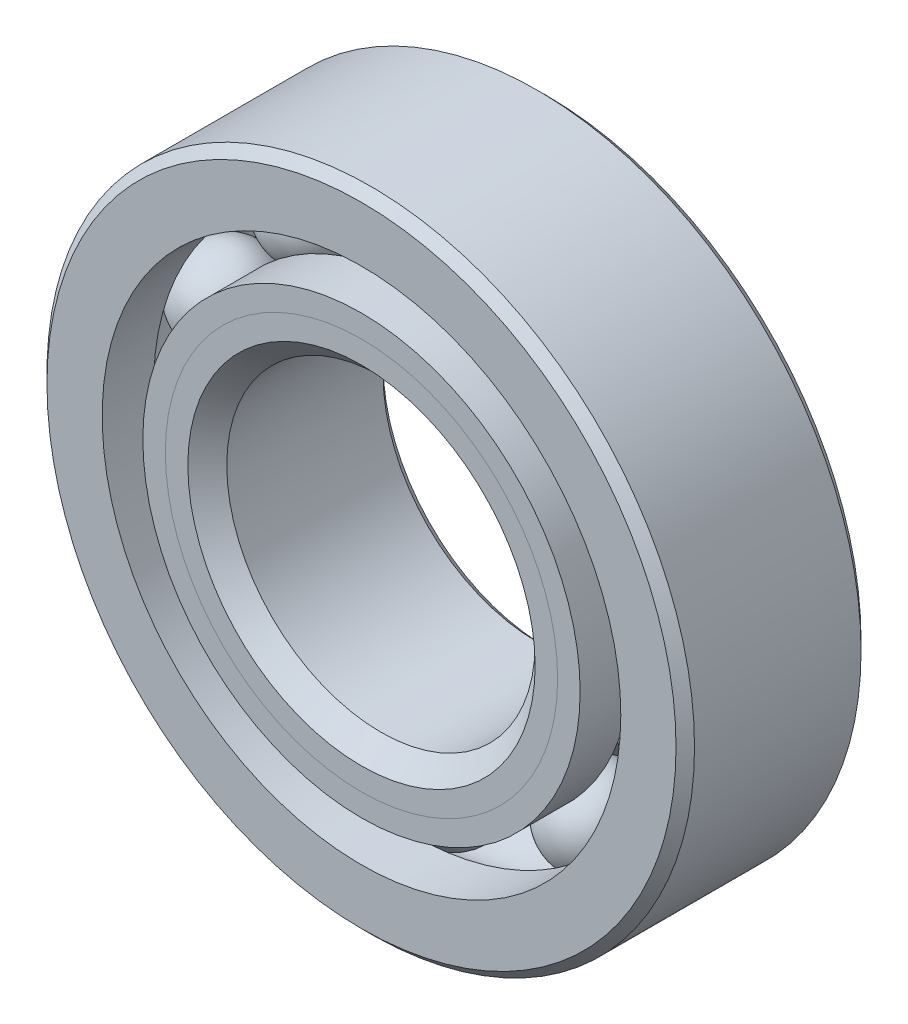
ISO-10303-21;
HEADER;
FILE_DESCRIPTION(('STEP AP214'),'2;1');
FILE_NAME('part.step','',(''),(''),'','','');
FILE_SCHEMA(('AUTOMOTIVE_DESIGN { 1 0 10303 214 1 1 1 1 }'));
ENDSEC;
DATA;
#1=APPLICATION_CONTEXT('core data for automotive mechanical design processes');
#2=APPLICATION_PROTOCOL_DEFINITION('international standard','automotive_design',2000,#1);
#3=PRODUCT_CONTEXT('',#1,'mechanical');
#4=PRODUCT('Part','Part','',(#3));
#5=PRODUCT_RELATED_PRODUCT_CATEGORY('part','',(#4));
#6=PRODUCT_DEFINITION_FORMATION('','',#4);
#7=PRODUCT_DEFINITION_CONTEXT('part definition',#1,'design');
#8=PRODUCT_DEFINITION('design','',#6,#7);
#9=PRODUCT_DEFINITION_SHAPE('','',#8);
#10=(LENGTH_UNIT() NAMED_UNIT(*) SI_UNIT(.MILLI.,.METRE.));
#11=(NAMED_UNIT(*) PLANE_ANGLE_UNIT() SI_UNIT($,.RADIAN.));
#12=(NAMED_UNIT(*) SI_UNIT($,.STERADIAN.) SOLID_ANGLE_UNIT());
#13=UNCERTAINTY_MEASURE_WITH_UNIT(LENGTH_MEASURE(1.E-05),#10,'distance_accuracy_value','');
#14=(GEOMETRIC_REPRESENTATION_CONTEXT(3) GLOBAL_UNCERTAINTY_ASSIGNED_CONTEXT((#13)) GLOBAL_UNIT_ASSIGNED_CONTEXT((#10,
#11,#12)) REPRESENTATION_CONTEXT('',''));
#15=CARTESIAN_POINT('',(0.,0.,0.));
#16=DIRECTION('',(0.,0.,1.));
#17=DIRECTION('',(1.,0.,0.));
#18=AXIS2_PLACEMENT_3D('',#15,#16,#17);
#19=CARTESIAN_POINT('',(-9.11067141053317,12.5397634128118,0.));
#20=DIRECTION('',(0.,0.,1.));
#21=DIRECTION('',(-0.587785252292462,0.809016994374955,0.));
#22=AXIS2_PLACEMENT_3D('',#19,#20,#21);
#23=SPHERICAL_SURFACE('',#22,2.97490025569769);
#24=CARTESIAN_POINT('',(-9.11067141053317,12.5397634128118,2.97490025569769));
#25=VERTEX_POINT('',#24);
#26=VERTEX_LOOP('',#25);
#27=FACE_BOUND('',#26,.T.);
#28=ADVANCED_FACE('F39',(#27),#23,.T.);
#29=CLOSED_SHELL('',(#28));
#30=MANIFOLD_SOLID_BREP('B2',#29);
#31=CARTESIAN_POINT('',(-14.7413760025748,4.78976341281185,0.));
#32=DIRECTION('',(0.,0.,1.));
#33=DIRECTION('',(-0.95105651629515,0.309016994374958,0.));
#34=AXIS2_PLACEMENT_3D('',#31,#32,#33);
#35=SPHERICAL_SURFACE('',#34,2.97490025569769);
#36=CARTESIAN_POINT('',(-14.7413760025748,4.78976341281185,2.97490025569769));
#37=VERTEX_POINT('',#36);
#38=VERTEX_LOOP('',#37);
#39=FACE_BOUND('',#38,.T.);
#40=ADVANCED_FACE('F72',(#39),#35,.T.);
#41=CLOSED_SHELL('',(#40));
#42=MANIFOLD_SOLID_BREP('B6',#41);
#43=CARTESIAN_POINT('',(-14.7413760025749,-4.78976341281154,0.));
#44=DIRECTION('',(0.,0.,1.));
#45=DIRECTION('',(-0.951056516295157,-0.309016994374938,0.));
#46=AXIS2_PLACEMENT_3D('',#43,#44,#45);
#47=SPHERICAL_SURFACE('',#46,2.97490025569769);
#48=CARTESIAN_POINT('',(-14.7413760025749,-4.78976341281154,2.97490025569769));
#49=VERTEX_POINT('',#48);
#50=VERTEX_LOOP('',#49);
#51=FACE_BOUND('',#50,.T.);
#52=ADVANCED_FACE('F105',(#51),#47,.T.);
#53=CLOSED_SHELL('',(#52));
#54=MANIFOLD_SOLID_BREP('B35',#53);
#55=CARTESIAN_POINT('',(-9.11067141053344,-12.5397634128116,0.));
#56=DIRECTION('',(0.,0.,1.));
#57=DIRECTION('',(-0.58778525229248,-0.809016994374942,0.));
#58=AXIS2_PLACEMENT_3D('',#55,#56,#57);
#59=SPHERICAL_SURFACE('',#58,2.97490025569769);
#60=CARTESIAN_POINT('',(-9.11067141053344,-12.5397634128116,2.97490025569769));
#61=VERTEX_POINT('',#60);
#62=VERTEX_LOOP('',#61);
#63=FACE_BOUND('',#62,.T.);
#64=ADVANCED_FACE('F138',(#63),#59,.T.);
#65=CLOSED_SHELL('',(#64));
#66=MANIFOLD_SOLID_BREP('B68',#65);
#67=CARTESIAN_POINT('',(-1.08235921504137E-13,-15.5,0.));
#68=DIRECTION('',(0.,0.,1.));
#69=DIRECTION('',(0.,-1.,0.));
#70=AXIS2_PLACEMENT_3D('',#67,#68,#69);
#71=SPHERICAL_SURFACE('',#70,2.97490025569769);
#72=CARTESIAN_POINT('',(-1.08235921504137E-13,-15.5,2.97490025569769));
#73=VERTEX_POINT('',#72);
#74=VERTEX_LOOP('',#73);
#75=FACE_BOUND('',#74,.T.);
#76=ADVANCED_FACE('F171',(#75),#71,.T.);
#77=CLOSED_SHELL('',(#76));
#78=MANIFOLD_SOLID_BREP('B101',#77);
#79=CARTESIAN_POINT('',(9.11067141053326,-12.5397634128117,0.));
#80=DIRECTION('',(0.,0.,1.));
#81=DIRECTION('',(0.587785252292469,-0.809016994374951,0.));
#82=AXIS2_PLACEMENT_3D('',#79,#80,#81);
#83=SPHERICAL_SURFACE('',#82,2.97490025569769);
#84=CARTESIAN_POINT('',(9.11067141053326,-12.5397634128117,2.97490025569769));
#85=VERTEX_POINT('',#84);
#86=VERTEX_LOOP('',#85);
#87=FACE_BOUND('',#86,.T.);
#88=ADVANCED_FACE('F204',(#87),#83,.T.);
#89=CLOSED_SHELL('',(#88));
#90=MANIFOLD_SOLID_BREP('B134',#89);
#91=CARTESIAN_POINT('',(14.7413760025749,-4.78976341281175,0.));
#92=DIRECTION('',(0.,0.,1.));
#93=DIRECTION('',(0.951056516295152,-0.309016994374952,0.));
#94=AXIS2_PLACEMENT_3D('',#91,#92,#93);
#95=SPHERICAL_SURFACE('',#94,2.97490025569769);
#96=CARTESIAN_POINT('',(14.7413760025749,-4.78976341281175,2.97490025569769));
#97=VERTEX_POINT('',#96);
#98=VERTEX_LOOP('',#97);
#99=FACE_BOUND('',#98,.T.);
#100=ADVANCED_FACE('F237',(#99),#95,.T.);
#101=CLOSED_SHELL('',(#100));
#102=MANIFOLD_SOLID_BREP('B167',#101);
#103=CARTESIAN_POINT('',(14.7413760025749,4.78976341281164,0.));
#104=DIRECTION('',(0.,0.,1.));
#105=DIRECTION('',(0.951056516295155,0.309016994374945,0.));
#106=AXIS2_PLACEMENT_3D('',#103,#104,#105);
#107=SPHERICAL_SURFACE('',#106,2.97490025569769);
#108=CARTESIAN_POINT('',(14.7413760025749,4.78976341281164,2.97490025569769));
#109=VERTEX_POINT('',#108);
#110=VERTEX_LOOP('',#109);
#111=FACE_BOUND('',#110,.T.);
#112=ADVANCED_FACE('F270',(#111),#107,.T.);
#113=CLOSED_SHELL('',(#112));
#114=MANIFOLD_SOLID_BREP('B200',#113);
#115=CARTESIAN_POINT('',(9.11067141053335,12.5397634128117,0.));
#116=DIRECTION('',(0.,0.,1.));
#117=DIRECTION('',(0.587785252292474,0.809016994374947,0.));
#118=AXIS2_PLACEMENT_3D('',#115,#116,#117);
#119=SPHERICAL_SURFACE('',#118,2.97490025569769);
#120=CARTESIAN_POINT('',(9.11067141053335,12.5397634128117,2.97490025569769));
#121=VERTEX_POINT('',#120);
#122=VERTEX_LOOP('',#121);
#123=FACE_BOUND('',#122,.T.);
#124=ADVANCED_FACE('F303',(#123),#119,.T.);
#125=CLOSED_SHELL('',(#124));
#126=MANIFOLD_SOLID_BREP('B233',#125);
#127=CARTESIAN_POINT('',(0.,15.5,0.));
#128=DIRECTION('',(0.,0.,1.));
#129=DIRECTION('',(0.,1.,0.));
#130=AXIS2_PLACEMENT_3D('',#127,#128,#129);
#131=SPHERICAL_SURFACE('',#130,2.97490025569769);
#132=CARTESIAN_POINT('',(0.,15.5,2.97490025569769));
#133=VERTEX_POINT('',#132);
#134=VERTEX_LOOP('',#133);
#135=FACE_BOUND('',#134,.T.);
#136=ADVANCED_FACE('F338',(#135),#131,.T.);
#137=CLOSED_SHELL('',(#136));
#138=MANIFOLD_SOLID_BREP('B266',#137);
#139=CARTESIAN_POINT('',(0.,12.7219342767349,6.));
#140=DIRECTION('',(0.,0.,-1.));
#141=DIRECTION('',(-1.,0.,0.));
#142=AXIS2_PLACEMENT_3D('',#139,#140,#141);
#143=PLANE('',#142);
#144=CARTESIAN_POINT('',(0.,0.,6.));
#145=DIRECTION('',(0.,0.,1.));
#146=DIRECTION('',(1.,0.,0.));
#147=AXIS2_PLACEMENT_3D('',#144,#145,#146);
#148=CIRCLE('',#147,11.2625498721512);
#149=CARTESIAN_POINT('',(11.2625498721512,0.,6.));
#150=VERTEX_POINT('',#149);
#151=EDGE_CURVE('E392',#150,#150,#148,.T.);
#152=ORIENTED_EDGE('',*,*,#151,.F.);
#153=EDGE_LOOP('',(#152));
#154=FACE_BOUND('',#153,.T.);
#155=CARTESIAN_POINT('',(0.,0.,6.));
#156=DIRECTION('',(0.,0.,1.));
#157=DIRECTION('',(1.,0.,0.));
#158=AXIS2_PLACEMENT_3D('',#155,#156,#157);
#159=CIRCLE('',#158,12.7219342767349);
#160=CARTESIAN_POINT('',(12.7219342767349,0.,6.));
#161=VERTEX_POINT('',#160);
#162=EDGE_CURVE('E337',#161,#161,#159,.T.);
#163=ORIENTED_EDGE('',*,*,#162,.T.);
#164=EDGE_LOOP('',(#163));
#165=FACE_BOUND('',#164,.T.);
#166=ADVANCED_FACE('F358',(#154,#165),#143,.F.);
#167=CARTESIAN_POINT('',(0.,0.,4.54061559541624));
#168=DIRECTION('',(0.,0.,1.));
#169=DIRECTION('',(1.,0.,0.));
#170=AXIS2_PLACEMENT_3D('',#167,#168,#169);
#171=CONICAL_SURFACE('',#170,11.2625498721512,0.78539816339745);
#172=ORIENTED_EDGE('',*,*,#162,.F.);
#173=EDGE_LOOP('',(#172));
#174=FACE_BOUND('',#173,.T.);
#175=CARTESIAN_POINT('',(0.,0.,4.54061559541624));
#176=DIRECTION('',(0.,0.,1.));
#177=DIRECTION('',(1.,0.,0.));
#178=AXIS2_PLACEMENT_3D('',#175,#176,#177);
#179=CIRCLE('',#178,11.2625498721512);
#180=CARTESIAN_POINT('',(11.2625498721512,0.,4.54061559541624));
#181=VERTEX_POINT('',#180);
#182=EDGE_CURVE('E364',#181,#181,#179,.T.);
#183=ORIENTED_EDGE('',*,*,#182,.T.);
#184=EDGE_LOOP('',(#183));
#185=FACE_BOUND('',#184,.T.);
#186=ADVANCED_FACE('F399',(#174,#185),#171,.T.);
#187=CARTESIAN_POINT('',(0.,0.,6.));
#188=DIRECTION('',(0.,0.,1.));
#189=DIRECTION('',(1.,0.,0.));
#190=AXIS2_PLACEMENT_3D('',#187,#188,#189);
#191=CYLINDRICAL_SURFACE('',#190,11.2625498721512);
#192=ORIENTED_EDGE('',*,*,#182,.F.);
#193=EDGE_LOOP('',(#192));
#194=FACE_BOUND('',#193,.T.);
#195=CARTESIAN_POINT('',(0.,0.,0.));
#196=DIRECTION('',(0.,0.,1.));
#197=DIRECTION('',(1.,0.,0.));
#198=AXIS2_PLACEMENT_3D('',#195,#196,#197);
#199=CIRCLE('',#198,11.2625498721512);
#200=CARTESIAN_POINT('',(11.2625498721512,0.,0.));
#201=VERTEX_POINT('',#200);
#202=EDGE_CURVE('E368',#201,#201,#199,.T.);
#203=ORIENTED_EDGE('',*,*,#202,.T.);
#204=EDGE_LOOP('',(#203));
#205=FACE_BOUND('',#204,.T.);
#206=ADVANCED_FACE('F403',(#194,#205),#191,.T.);
#207=CARTESIAN_POINT('',(0.,11.2625498721512,0.));
#208=DIRECTION('',(0.,0.,-1.));
#209=DIRECTION('',(-1.,0.,0.));
#210=AXIS2_PLACEMENT_3D('',#207,#208,#209);
#211=PLANE('',#210);
#212=ORIENTED_EDGE('',*,*,#202,.F.);
#213=EDGE_LOOP('',(#212));
#214=FACE_BOUND('',#213,.T.);
#215=CARTESIAN_POINT('',(0.,0.,0.));
#216=DIRECTION('',(0.,0.,1.));
#217=DIRECTION('',(1.,0.,0.));
#218=AXIS2_PLACEMENT_3D('',#215,#216,#217);
#219=CIRCLE('',#218,12.5250997443023);
#220=CARTESIAN_POINT('',(12.5250997443023,0.,0.));
#221=VERTEX_POINT('',#220);
#222=EDGE_CURVE('E372',#221,#221,#219,.T.);
#223=ORIENTED_EDGE('',*,*,#222,.T.);
#224=EDGE_LOOP('',(#223));
#225=FACE_BOUND('',#224,.T.);
#226=ADVANCED_FACE('F408',(#214,#225),#211,.F.);
#227=CARTESIAN_POINT('',(0.,0.,0.));
#228=DIRECTION('',(0.,0.,1.));
#229=DIRECTION('',(1.,0.,0.));
#230=AXIS2_PLACEMENT_3D('',#227,#228,#229);
#231=TOROIDAL_SURFACE('',#230,15.5,2.97490025569769);
#232=ORIENTED_EDGE('',*,*,#222,.F.);
#233=EDGE_LOOP('',(#232));
#234=FACE_BOUND('',#233,.T.);
#235=CARTESIAN_POINT('',(0.,0.,-2.66666666666667));
#236=DIRECTION('',(0.,0.,1.));
#237=DIRECTION('',(1.,0.,0.));
#238=AXIS2_PLACEMENT_3D('',#235,#236,#237);
#239=CIRCLE('',#238,14.1813186813187);
#240=CARTESIAN_POINT('',(14.1813186813187,0.,-2.66666666666667));
#241=VERTEX_POINT('',#240);
#242=EDGE_CURVE('E377',#241,#241,#239,.T.);
#243=ORIENTED_EDGE('',*,*,#242,.T.);
#244=EDGE_LOOP('',(#243));
#245=FACE_BOUND('',#244,.T.);
#246=ADVANCED_FACE('F414',(#234,#245),#231,.F.);
#247=CARTESIAN_POINT('',(0.,0.,6.));
#248=DIRECTION('',(0.,0.,1.));
#249=DIRECTION('',(1.,0.,0.));
#250=AXIS2_PLACEMENT_3D('',#247,#248,#249);
#251=CYLINDRICAL_SURFACE('',#250,14.1813186813187);
#252=ORIENTED_EDGE('',*,*,#242,.F.);
#253=EDGE_LOOP('',(#252));
#254=FACE_BOUND('',#253,.T.);
#255=CARTESIAN_POINT('',(0.,0.,-6.));
#256=DIRECTION('',(0.,0.,1.));
#257=DIRECTION('',(1.,0.,0.));
#258=AXIS2_PLACEMENT_3D('',#255,#256,#257);
#259=CIRCLE('',#258,14.1813186813187);
#260=CARTESIAN_POINT('',(14.1813186813187,0.,-6.));
#261=VERTEX_POINT('',#260);
#262=EDGE_CURVE('E380',#261,#261,#259,.T.);
#263=ORIENTED_EDGE('',*,*,#262,.T.);
#264=EDGE_LOOP('',(#263));
#265=FACE_BOUND('',#264,.T.);
#266=ADVANCED_FACE('F418',(#254,#265),#251,.T.);
#267=CARTESIAN_POINT('',(0.,10.6,-6.));
#268=DIRECTION('',(0.,0.,1.));
#269=DIRECTION('',(1.,0.,0.));
#270=AXIS2_PLACEMENT_3D('',#267,#268,#269);
#271=PLANE('',#270);
#272=ORIENTED_EDGE('',*,*,#262,.F.);
#273=EDGE_LOOP('',(#272));
#274=FACE_BOUND('',#273,.T.);
#275=CARTESIAN_POINT('',(0.,0.,-6.));
#276=DIRECTION('',(0.,0.,1.));
#277=DIRECTION('',(1.,0.,0.));
#278=AXIS2_PLACEMENT_3D('',#275,#276,#277);
#279=CIRCLE('',#278,10.6);
#280=CARTESIAN_POINT('',(10.6,0.,-6.));
#281=VERTEX_POINT('',#280);
#282=EDGE_CURVE('E383',#281,#281,#279,.T.);
#283=ORIENTED_EDGE('',*,*,#282,.T.);
#284=EDGE_LOOP('',(#283));
#285=FACE_BOUND('',#284,.T.);
#286=ADVANCED_FACE('F422',(#274,#285),#271,.F.);
#287=CARTESIAN_POINT('',(0.,0.,-5.4));
#288=DIRECTION('',(0.,0.,-1.));
#289=DIRECTION('',(-1.,0.,0.));
#290=AXIS2_PLACEMENT_3D('',#287,#288,#289);
#291=CONICAL_SURFACE('',#290,10.,0.785398163397445);
#292=ORIENTED_EDGE('',*,*,#282,.F.);
#293=EDGE_LOOP('',(#292));
#294=FACE_BOUND('',#293,.T.);
#295=CARTESIAN_POINT('',(0.,0.,-5.4));
#296=DIRECTION('',(0.,0.,1.));
#297=DIRECTION('',(1.,0.,0.));
#298=AXIS2_PLACEMENT_3D('',#295,#296,#297);
#299=CIRCLE('',#298,10.);
#300=CARTESIAN_POINT('',(10.,0.,-5.4));
#301=VERTEX_POINT('',#300);
#302=EDGE_CURVE('E386',#301,#301,#299,.T.);
#303=ORIENTED_EDGE('',*,*,#302,.T.);
#304=EDGE_LOOP('',(#303));
#305=FACE_BOUND('',#304,.T.);
#306=ADVANCED_FACE('F426',(#294,#305),#291,.F.);
#307=CARTESIAN_POINT('',(0.,0.,6.));
#308=DIRECTION('',(0.,0.,1.));
#309=DIRECTION('',(1.,0.,0.));
#310=AXIS2_PLACEMENT_3D('',#307,#308,#309);
#311=CYLINDRICAL_SURFACE('',#310,10.);
#312=ORIENTED_EDGE('',*,*,#302,.F.);
#313=EDGE_LOOP('',(#312));
#314=FACE_BOUND('',#313,.T.);
#315=CARTESIAN_POINT('',(0.,0.,4.73745012784885));
#316=DIRECTION('',(0.,0.,1.));
#317=DIRECTION('',(1.,0.,0.));
#318=AXIS2_PLACEMENT_3D('',#315,#316,#317);
#319=CIRCLE('',#318,10.);
#320=CARTESIAN_POINT('',(10.,0.,4.73745012784885));
#321=VERTEX_POINT('',#320);
#322=EDGE_CURVE('E389',#321,#321,#319,.T.);
#323=ORIENTED_EDGE('',*,*,#322,.T.);
#324=EDGE_LOOP('',(#323));
#325=FACE_BOUND('',#324,.T.);
#326=ADVANCED_FACE('F430',(#314,#325),#311,.F.);
#327=CARTESIAN_POINT('',(0.,0.,6.));
#328=DIRECTION('',(0.,0.,1.));
#329=DIRECTION('',(1.,0.,0.));
#330=AXIS2_PLACEMENT_3D('',#327,#328,#329);
#331=CONICAL_SURFACE('',#330,11.2625498721512,0.785398163397449);
#332=ORIENTED_EDGE('',*,*,#322,.F.);
#333=EDGE_LOOP('',(#332));
#334=FACE_BOUND('',#333,.T.);
#335=ORIENTED_EDGE('',*,*,#151,.T.);
#336=EDGE_LOOP('',(#335));
#337=FACE_BOUND('',#336,.T.);
#338=ADVANCED_FACE('F396',(#334,#337),#331,.F.);
#339=CLOSED_SHELL('',(#166,#186,#206,#226,#246,#266,#286,#306,#326,#338));
#340=MANIFOLD_SOLID_BREP('B299',#339);
#341=CARTESIAN_POINT('',(0.,14.1813186813187,6.));
#342=DIRECTION('',(0.,0.,-1.));
#343=DIRECTION('',(-1.,0.,0.));
#344=AXIS2_PLACEMENT_3D('',#341,#342,#343);
#345=PLANE('',#344);
#346=CARTESIAN_POINT('',(0.,0.,6.));
#347=DIRECTION('',(0.,0.,1.));
#348=DIRECTION('',(1.,0.,0.));
#349=AXIS2_PLACEMENT_3D('',#346,#347,#348);
#350=CIRCLE('',#349,12.7219342767349);
#351=CARTESIAN_POINT('',(12.7219342767349,0.,6.));
#352=VERTEX_POINT('',#351);
#353=EDGE_CURVE('E357',#352,#352,#350,.T.);
#354=ORIENTED_EDGE('',*,*,#353,.F.);
#355=EDGE_LOOP('',(#354));
#356=FACE_BOUND('',#355,.T.);
#357=CARTESIAN_POINT('',(0.,0.,6.));
#358=DIRECTION('',(0.,0.,1.));
#359=DIRECTION('',(1.,0.,0.));
#360=AXIS2_PLACEMENT_3D('',#357,#358,#359);
#361=CIRCLE('',#360,14.1813186813187);
#362=CARTESIAN_POINT('',(14.1813186813187,0.,6.));
#363=VERTEX_POINT('',#362);
#364=EDGE_CURVE('E538',#363,#363,#361,.T.);
#365=ORIENTED_EDGE('',*,*,#364,.T.);
#366=EDGE_LOOP('',(#365));
#367=FACE_BOUND('',#366,.T.);
#368=ADVANCED_FACE('F516',(#356,#367),#345,.F.);
#369=CARTESIAN_POINT('',(0.,0.,6.));
#370=DIRECTION('',(0.,0.,1.));
#371=DIRECTION('',(1.,0.,0.));
#372=AXIS2_PLACEMENT_3D('',#369,#370,#371);
#373=CONICAL_SURFACE('',#372,12.7219342767349,0.78539816339745);
#374=CARTESIAN_POINT('',(0.,0.,4.54061559541624));
#375=DIRECTION('',(0.,0.,1.));
#376=DIRECTION('',(1.,0.,0.));
#377=AXIS2_PLACEMENT_3D('',#374,#375,#376);
#378=CIRCLE('',#377,11.2625498721512);
#379=CARTESIAN_POINT('',(11.2625498721512,0.,4.54061559541624));
#380=VERTEX_POINT('',#379);
#381=EDGE_CURVE('E522',#380,#380,#378,.T.);
#382=ORIENTED_EDGE('',*,*,#381,.F.);
#383=EDGE_LOOP('',(#382));
#384=FACE_BOUND('',#383,.T.);
#385=ORIENTED_EDGE('',*,*,#353,.T.);
#386=EDGE_LOOP('',(#385));
#387=FACE_BOUND('',#386,.T.);
#388=ADVANCED_FACE('F563',(#384,#387),#373,.F.);
#389=CARTESIAN_POINT('',(0.,0.,6.));
#390=DIRECTION('',(0.,0.,1.));
#391=DIRECTION('',(1.,0.,0.));
#392=AXIS2_PLACEMENT_3D('',#389,#390,#391);
#393=CYLINDRICAL_SURFACE('',#392,11.2625498721512);
#394=CARTESIAN_POINT('',(0.,0.,0.));
#395=DIRECTION('',(0.,0.,1.));
#396=DIRECTION('',(1.,0.,0.));
#397=AXIS2_PLACEMENT_3D('',#394,#395,#396);
#398=CIRCLE('',#397,11.2625498721512);
#399=CARTESIAN_POINT('',(11.2625498721512,0.,0.));
#400=VERTEX_POINT('',#399);
#401=EDGE_CURVE('E526',#400,#400,#398,.T.);
#402=ORIENTED_EDGE('',*,*,#401,.F.);
#403=EDGE_LOOP('',(#402));
#404=FACE_BOUND('',#403,.T.);
#405=ORIENTED_EDGE('',*,*,#381,.T.);
#406=EDGE_LOOP('',(#405));
#407=FACE_BOUND('',#406,.T.);
#408=ADVANCED_FACE('F558',(#404,#407),#393,.F.);
#409=CARTESIAN_POINT('',(0.,11.2625498721512,0.));
#410=DIRECTION('',(0.,0.,1.));
#411=DIRECTION('',(1.,0.,0.));
#412=AXIS2_PLACEMENT_3D('',#409,#410,#411);
#413=PLANE('',#412);
#414=CARTESIAN_POINT('',(0.,0.,0.));
#415=DIRECTION('',(0.,0.,1.));
#416=DIRECTION('',(1.,0.,0.));
#417=AXIS2_PLACEMENT_3D('',#414,#415,#416);
#418=CIRCLE('',#417,12.5250997443023);
#419=CARTESIAN_POINT('',(12.5250997443023,0.,0.));
#420=VERTEX_POINT('',#419);
#421=EDGE_CURVE('E530',#420,#420,#418,.T.);
#422=ORIENTED_EDGE('',*,*,#421,.F.);
#423=EDGE_LOOP('',(#422));
#424=FACE_BOUND('',#423,.T.);
#425=ORIENTED_EDGE('',*,*,#401,.T.);
#426=EDGE_LOOP('',(#425));
#427=FACE_BOUND('',#426,.T.);
#428=ADVANCED_FACE('F552',(#424,#427),#413,.F.);
#429=CARTESIAN_POINT('',(0.,0.,0.));
#430=DIRECTION('',(0.,0.,1.));
#431=DIRECTION('',(1.,0.,0.));
#432=AXIS2_PLACEMENT_3D('',#429,#430,#431);
#433=TOROIDAL_SURFACE('',#432,15.5,2.97490025569769);
#434=CARTESIAN_POINT('',(0.,0.,2.66666666666667));
#435=DIRECTION('',(0.,0.,1.));
#436=DIRECTION('',(1.,0.,0.));
#437=AXIS2_PLACEMENT_3D('',#434,#435,#436);
#438=CIRCLE('',#437,14.1813186813187);
#439=CARTESIAN_POINT('',(14.1813186813187,0.,2.66666666666667));
#440=VERTEX_POINT('',#439);
#441=EDGE_CURVE('E535',#440,#440,#438,.T.);
#442=ORIENTED_EDGE('',*,*,#441,.F.);
#443=EDGE_LOOP('',(#442));
#444=FACE_BOUND('',#443,.T.);
#445=ORIENTED_EDGE('',*,*,#421,.T.);
#446=EDGE_LOOP('',(#445));
#447=FACE_BOUND('',#446,.T.);
#448=ADVANCED_FACE('F546',(#444,#447),#433,.F.);
#449=CARTESIAN_POINT('',(0.,0.,6.));
#450=DIRECTION('',(0.,0.,1.));
#451=DIRECTION('',(1.,0.,0.));
#452=AXIS2_PLACEMENT_3D('',#449,#450,#451);
#453=CYLINDRICAL_SURFACE('',#452,14.1813186813187);
#454=ORIENTED_EDGE('',*,*,#364,.F.);
#455=EDGE_LOOP('',(#454));
#456=FACE_BOUND('',#455,.T.);
#457=ORIENTED_EDGE('',*,*,#441,.T.);
#458=EDGE_LOOP('',(#457));
#459=FACE_BOUND('',#458,.T.);
#460=ADVANCED_FACE('F543',(#456,#459),#453,.T.);
#461=CLOSED_SHELL('',(#368,#388,#408,#428,#448,#460));
#462=MANIFOLD_SOLID_BREP('B332',#461);
#463=CARTESIAN_POINT('',(0.,0.,5.4));
#464=DIRECTION('',(0.,0.,-1.));
#465=DIRECTION('',(-1.,0.,0.));
#466=AXIS2_PLACEMENT_3D('',#463,#464,#465);
#467=CONICAL_SURFACE('',#466,21.,0.785398163397446);
#468=CARTESIAN_POINT('',(0.,0.,6.));
#469=DIRECTION('',(0.,0.,1.));
#470=DIRECTION('',(1.,0.,0.));
#471=AXIS2_PLACEMENT_3D('',#468,#469,#470);
#472=CIRCLE('',#471,20.4);
#473=CARTESIAN_POINT('',(20.4,0.,6.));
#474=VERTEX_POINT('',#473);
#475=EDGE_CURVE('E635',#474,#474,#472,.T.);
#476=ORIENTED_EDGE('',*,*,#475,.F.);
#477=EDGE_LOOP('',(#476));
#478=FACE_BOUND('',#477,.T.);
#479=CARTESIAN_POINT('',(0.,0.,5.4));
#480=DIRECTION('',(0.,0.,1.));
#481=DIRECTION('',(1.,0.,0.));
#482=AXIS2_PLACEMENT_3D('',#479,#480,#481);
#483=CIRCLE('',#482,21.);
#484=CARTESIAN_POINT('',(21.,0.,5.4));
#485=VERTEX_POINT('',#484);
#486=EDGE_CURVE('E515',#485,#485,#483,.T.);
#487=ORIENTED_EDGE('',*,*,#486,.T.);
#488=EDGE_LOOP('',(#487));
#489=FACE_BOUND('',#488,.T.);
#490=ADVANCED_FACE('F607',(#478,#489),#467,.T.);
#491=CARTESIAN_POINT('',(0.,0.,6.));
#492=DIRECTION('',(0.,0.,1.));
#493=DIRECTION('',(1.,0.,0.));
#494=AXIS2_PLACEMENT_3D('',#491,#492,#493);
#495=CYLINDRICAL_SURFACE('',#494,21.);
#496=ORIENTED_EDGE('',*,*,#486,.F.);
#497=EDGE_LOOP('',(#496));
#498=FACE_BOUND('',#497,.T.);
#499=CARTESIAN_POINT('',(0.,0.,-5.4));
#500=DIRECTION('',(0.,0.,1.));
#501=DIRECTION('',(1.,0.,0.));
#502=AXIS2_PLACEMENT_3D('',#499,#500,#501);
#503=CIRCLE('',#502,21.);
#504=CARTESIAN_POINT('',(21.,0.,-5.4));
#505=VERTEX_POINT('',#504);
#506=EDGE_CURVE('E613',#505,#505,#503,.T.);
#507=ORIENTED_EDGE('',*,*,#506,.T.);
#508=EDGE_LOOP('',(#507));
#509=FACE_BOUND('',#508,.T.);
#510=ADVANCED_FACE('F642',(#498,#509),#495,.T.);
#511=CARTESIAN_POINT('',(0.,0.,-6.));
#512=DIRECTION('',(0.,0.,1.));
#513=DIRECTION('',(1.,0.,0.));
#514=AXIS2_PLACEMENT_3D('',#511,#512,#513);
#515=CONICAL_SURFACE('',#514,20.4,0.785398163397447);
#516=ORIENTED_EDGE('',*,*,#506,.F.);
#517=EDGE_LOOP('',(#516));
#518=FACE_BOUND('',#517,.T.);
#519=CARTESIAN_POINT('',(0.,0.,-6.));
#520=DIRECTION('',(0.,0.,1.));
#521=DIRECTION('',(1.,0.,0.));
#522=AXIS2_PLACEMENT_3D('',#519,#520,#521);
#523=CIRCLE('',#522,20.4);
#524=CARTESIAN_POINT('',(20.4,0.,-6.));
#525=VERTEX_POINT('',#524);
#526=EDGE_CURVE('E617',#525,#525,#523,.T.);
#527=ORIENTED_EDGE('',*,*,#526,.T.);
#528=EDGE_LOOP('',(#527));
#529=FACE_BOUND('',#528,.T.);
#530=ADVANCED_FACE('F646',(#518,#529),#515,.T.);
#531=CARTESIAN_POINT('',(0.,20.4,-6.));
#532=DIRECTION('',(0.,0.,1.));
#533=DIRECTION('',(1.,0.,0.));
#534=AXIS2_PLACEMENT_3D('',#531,#532,#533);
#535=PLANE('',#534);
#536=ORIENTED_EDGE('',*,*,#526,.F.);
#537=EDGE_LOOP('',(#536));
#538=FACE_BOUND('',#537,.T.);
#539=CARTESIAN_POINT('',(0.,0.,-6.));
#540=DIRECTION('',(0.,0.,1.));
#541=DIRECTION('',(1.,0.,0.));
#542=AXIS2_PLACEMENT_3D('',#539,#540,#541);
#543=CIRCLE('',#542,16.8186813186813);
#544=CARTESIAN_POINT('',(16.8186813186813,0.,-6.));
#545=VERTEX_POINT('',#544);
#546=EDGE_CURVE('E621',#545,#545,#543,.T.);
#547=ORIENTED_EDGE('',*,*,#546,.T.);
#548=EDGE_LOOP('',(#547));
#549=FACE_BOUND('',#548,.T.);
#550=ADVANCED_FACE('F651',(#538,#549),#535,.F.);
#551=CARTESIAN_POINT('',(0.,0.,6.));
#552=DIRECTION('',(0.,0.,1.));
#553=DIRECTION('',(1.,0.,0.));
#554=AXIS2_PLACEMENT_3D('',#551,#552,#553);
#555=CYLINDRICAL_SURFACE('',#554,16.8186813186813);
#556=ORIENTED_EDGE('',*,*,#546,.F.);
#557=EDGE_LOOP('',(#556));
#558=FACE_BOUND('',#557,.T.);
#559=CARTESIAN_POINT('',(0.,0.,-2.66666666666667));
#560=DIRECTION('',(0.,0.,1.));
#561=DIRECTION('',(1.,0.,0.));
#562=AXIS2_PLACEMENT_3D('',#559,#560,#561);
#563=CIRCLE('',#562,16.8186813186813);
#564=CARTESIAN_POINT('',(16.8186813186813,0.,-2.66666666666667));
#565=VERTEX_POINT('',#564);
#566=EDGE_CURVE('E626',#565,#565,#563,.T.);
#567=ORIENTED_EDGE('',*,*,#566,.T.);
#568=EDGE_LOOP('',(#567));
#569=FACE_BOUND('',#568,.T.);
#570=ADVANCED_FACE('F657',(#558,#569),#555,.F.);
#571=CARTESIAN_POINT('',(0.,0.,0.));
#572=DIRECTION('',(0.,0.,1.));
#573=DIRECTION('',(1.,0.,0.));
#574=AXIS2_PLACEMENT_3D('',#571,#572,#573);
#575=TOROIDAL_SURFACE('',#574,15.5,2.97490025569769);
#576=ORIENTED_EDGE('',*,*,#566,.F.);
#577=EDGE_LOOP('',(#576));
#578=FACE_BOUND('',#577,.T.);
#579=CARTESIAN_POINT('',(0.,0.,2.66666666666667));
#580=DIRECTION('',(0.,0.,1.));
#581=DIRECTION('',(1.,0.,0.));
#582=AXIS2_PLACEMENT_3D('',#579,#580,#581);
#583=CIRCLE('',#582,16.8186813186813);
#584=CARTESIAN_POINT('',(16.8186813186813,0.,2.66666666666667));
#585=VERTEX_POINT('',#584);
#586=EDGE_CURVE('E629',#585,#585,#583,.T.);
#587=ORIENTED_EDGE('',*,*,#586,.T.);
#588=EDGE_LOOP('',(#587));
#589=FACE_BOUND('',#588,.T.);
#590=ADVANCED_FACE('F661',(#578,#589),#575,.F.);
#591=CARTESIAN_POINT('',(0.,0.,6.));
#592=DIRECTION('',(0.,0.,1.));
#593=DIRECTION('',(1.,0.,0.));
#594=AXIS2_PLACEMENT_3D('',#591,#592,#593);
#595=CYLINDRICAL_SURFACE('',#594,16.8186813186813);
#596=ORIENTED_EDGE('',*,*,#586,.F.);
#597=EDGE_LOOP('',(#596));
#598=FACE_BOUND('',#597,.T.);
#599=CARTESIAN_POINT('',(0.,0.,6.));
#600=DIRECTION('',(0.,0.,1.));
#601=DIRECTION('',(1.,0.,0.));
#602=AXIS2_PLACEMENT_3D('',#599,#600,#601);
#603=CIRCLE('',#602,16.8186813186813);
#604=CARTESIAN_POINT('',(16.8186813186813,0.,6.));
#605=VERTEX_POINT('',#604);
#606=EDGE_CURVE('E632',#605,#605,#603,.T.);
#607=ORIENTED_EDGE('',*,*,#606,.T.);
#608=EDGE_LOOP('',(#607));
#609=FACE_BOUND('',#608,.T.);
#610=ADVANCED_FACE('F665',(#598,#609),#595,.F.);
#611=CARTESIAN_POINT('',(0.,20.4,6.));
#612=DIRECTION('',(0.,0.,-1.));
#613=DIRECTION('',(-1.,0.,0.));
#614=AXIS2_PLACEMENT_3D('',#611,#612,#613);
#615=PLANE('',#614);
#616=ORIENTED_EDGE('',*,*,#606,.F.);
#617=EDGE_LOOP('',(#616));
#618=FACE_BOUND('',#617,.T.);
#619=ORIENTED_EDGE('',*,*,#475,.T.);
#620=EDGE_LOOP('',(#619));
#621=FACE_BOUND('',#620,.T.);
#622=ADVANCED_FACE('F639',(#618,#621),#615,.F.);
#623=CLOSED_SHELL('',(#490,#510,#530,#550,#570,#590,#610,#622));
#624=MANIFOLD_SOLID_BREP('B352',#623);
#625=ADVANCED_BREP_SHAPE_REPRESENTATION('',(#18,#30,#42,#54,#66,#78,#90,#102,#114,#126,#138,
#340,#462,#624),#14);
#626=SHAPE_DEFINITION_REPRESENTATION(#9,#625);
ENDSEC;
END-ISO-10303-21;
